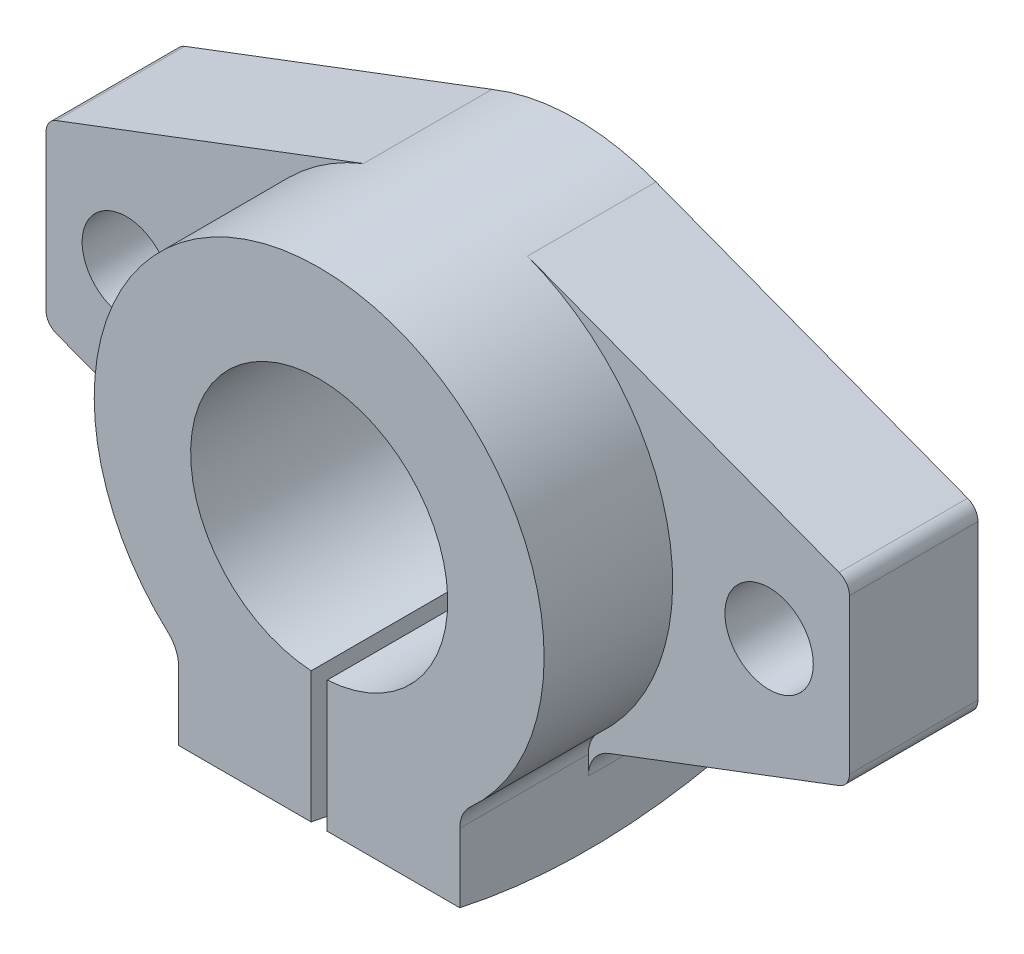
ISO-10303-21;
HEADER;
FILE_DESCRIPTION(('STEP AP214'),'2;1');
FILE_NAME('part.step','',(''),(''),'','','');
FILE_SCHEMA(('AUTOMOTIVE_DESIGN { 1 0 10303 214 1 1 1 1 }'));
ENDSEC;
DATA;
#1=APPLICATION_CONTEXT('core data for automotive mechanical design processes');
#2=APPLICATION_PROTOCOL_DEFINITION('international standard','automotive_design',2000,#1);
#3=PRODUCT_CONTEXT('',#1,'mechanical');
#4=PRODUCT('Part','Part','',(#3));
#5=PRODUCT_RELATED_PRODUCT_CATEGORY('part','',(#4));
#6=PRODUCT_DEFINITION_FORMATION('','',#4);
#7=PRODUCT_DEFINITION_CONTEXT('part definition',#1,'design');
#8=PRODUCT_DEFINITION('design','',#6,#7);
#9=PRODUCT_DEFINITION_SHAPE('','',#8);
#10=(LENGTH_UNIT() NAMED_UNIT(*) SI_UNIT(.MILLI.,.METRE.));
#11=(NAMED_UNIT(*) PLANE_ANGLE_UNIT() SI_UNIT($,.RADIAN.));
#12=(NAMED_UNIT(*) SI_UNIT($,.STERADIAN.) SOLID_ANGLE_UNIT());
#13=UNCERTAINTY_MEASURE_WITH_UNIT(LENGTH_MEASURE(1.E-05),#10,'distance_accuracy_value','');
#14=(GEOMETRIC_REPRESENTATION_CONTEXT(3) GLOBAL_UNCERTAINTY_ASSIGNED_CONTEXT((#13)) GLOBAL_UNIT_ASSIGNED_CONTEXT((#10,
#11,#12)) REPRESENTATION_CONTEXT('',''));
#15=CARTESIAN_POINT('',(0.,0.,0.));
#16=DIRECTION('',(0.,0.,1.));
#17=DIRECTION('',(1.,0.,0.));
#18=AXIS2_PLACEMENT_3D('',#15,#16,#17);
#19=CARTESIAN_POINT('',(-12.75,-10.85,0.));
#20=DIRECTION('',(-1.,0.,0.));
#21=DIRECTION('',(0.,0.,1.));
#22=AXIS2_PLACEMENT_3D('',#19,#20,#21);
#23=PLANE('',#22);
#24=CARTESIAN_POINT('',(-12.75,-12.5,0.));
#25=DIRECTION('',(1.,0.,0.));
#26=DIRECTION('',(0.,1.,0.));
#27=AXIS2_PLACEMENT_3D('',#24,#25,#26);
#28=CIRCLE('',#27,3.3);
#29=CARTESIAN_POINT('',(-12.75,-9.2,0.));
#30=VERTEX_POINT('',#29);
#31=EDGE_CURVE('E342',#30,#30,#28,.T.);
#32=ORIENTED_EDGE('',*,*,#31,.F.);
#33=EDGE_LOOP('',(#32));
#34=FACE_BOUND('',#33,.T.);
#35=ADVANCED_FACE('F16',(#34),#23,.T.);
#36=CARTESIAN_POINT('',(-24.,4.80936795279443,0.));
#37=DIRECTION('',(0.,0.,-1.));
#38=DIRECTION('',(-1.,0.,0.));
#39=AXIS2_PLACEMENT_3D('',#36,#37,#38);
#40=CYLINDRICAL_SURFACE('',#39,1.);
#41=CARTESIAN_POINT('',(-24.,4.80936795279443,0.));
#42=DIRECTION('',(0.,0.,-1.));
#43=DIRECTION('',(-1.,0.,0.));
#44=AXIS2_PLACEMENT_3D('',#41,#42,#43);
#45=CIRCLE('',#44,1.);
#46=CARTESIAN_POINT('',(-24.3541212387092,5.74456747604872,0.));
#47=VERTEX_POINT('',#46);
#48=CARTESIAN_POINT('',(-25.,4.80936795279443,0.));
#49=VERTEX_POINT('',#48);
#50=EDGE_CURVE('E327',#47,#49,#45,.F.);
#51=ORIENTED_EDGE('',*,*,#50,.F.);
#52=DIRECTION('',(0.,0.,1.));
#53=VECTOR('',#52,1.);
#54=CARTESIAN_POINT('',(-24.3541212387092,5.74456747604872,0.));
#55=LINE('',#54,#53);
#56=CARTESIAN_POINT('',(-24.3541212387092,5.74456747604872,-8.));
#57=VERTEX_POINT('',#56);
#58=EDGE_CURVE('E449',#57,#47,#55,.T.);
#59=ORIENTED_EDGE('',*,*,#58,.F.);
#60=CARTESIAN_POINT('',(-24.,4.80936795279443,-8.));
#61=DIRECTION('',(0.,0.,-1.));
#62=DIRECTION('',(-1.,0.,0.));
#63=AXIS2_PLACEMENT_3D('',#60,#61,#62);
#64=CIRCLE('',#63,1.);
#65=CARTESIAN_POINT('',(-25.,4.80936795279443,-8.));
#66=VERTEX_POINT('',#65);
#67=EDGE_CURVE('E19',#57,#66,#64,.F.);
#68=ORIENTED_EDGE('',*,*,#67,.T.);
#69=DIRECTION('',(0.,0.,1.));
#70=VECTOR('',#69,1.);
#71=CARTESIAN_POINT('',(-25.,4.80936795279443,0.));
#72=LINE('',#71,#70);
#73=EDGE_CURVE('E441',#49,#66,#72,.F.);
#74=ORIENTED_EDGE('',*,*,#73,.F.);
#75=EDGE_LOOP('',(#51,#59,#68,#74));
#76=FACE_BOUND('',#75,.T.);
#77=ADVANCED_FACE('F358',(#76),#40,.T.);
#78=CARTESIAN_POINT('',(-24.,-4.80948412841701,0.));
#79=DIRECTION('',(0.,0.,-1.));
#80=DIRECTION('',(-1.,0.,0.));
#81=AXIS2_PLACEMENT_3D('',#78,#79,#80);
#82=CYLINDRICAL_SURFACE('',#81,1.);
#83=CARTESIAN_POINT('',(-24.,-4.80948412841701,0.));
#84=DIRECTION('',(0.,0.,-1.));
#85=DIRECTION('',(-1.,0.,0.));
#86=AXIS2_PLACEMENT_3D('',#83,#84,#85);
#87=CIRCLE('',#86,1.);
#88=CARTESIAN_POINT('',(-25.,-4.80948412841701,0.));
#89=VERTEX_POINT('',#88);
#90=CARTESIAN_POINT('',(-24.3542683640526,-5.74462792817805,0.));
#91=VERTEX_POINT('',#90);
#92=EDGE_CURVE('E324',#89,#91,#87,.F.);
#93=ORIENTED_EDGE('',*,*,#92,.F.);
#94=DIRECTION('',(0.,0.,1.));
#95=VECTOR('',#94,1.);
#96=CARTESIAN_POINT('',(-25.,-4.80948412841701,0.));
#97=LINE('',#96,#95);
#98=CARTESIAN_POINT('',(-25.,-4.80948412841701,-8.));
#99=VERTEX_POINT('',#98);
#100=EDGE_CURVE('E444',#99,#89,#97,.T.);
#101=ORIENTED_EDGE('',*,*,#100,.F.);
#102=CARTESIAN_POINT('',(-24.,-4.80948412841701,-8.));
#103=DIRECTION('',(0.,0.,-1.));
#104=DIRECTION('',(-1.,0.,0.));
#105=AXIS2_PLACEMENT_3D('',#102,#103,#104);
#106=CIRCLE('',#105,1.);
#107=CARTESIAN_POINT('',(-24.3542683640526,-5.74462792817805,-8.));
#108=VERTEX_POINT('',#107);
#109=EDGE_CURVE('E350',#99,#108,#106,.F.);
#110=ORIENTED_EDGE('',*,*,#109,.T.);
#111=DIRECTION('',(0.,0.,1.));
#112=VECTOR('',#111,1.);
#113=CARTESIAN_POINT('',(-24.3542683640526,-5.74462792817805,0.));
#114=LINE('',#113,#112);
#115=EDGE_CURVE('E435',#91,#108,#114,.F.);
#116=ORIENTED_EDGE('',*,*,#115,.F.);
#117=EDGE_LOOP('',(#93,#101,#110,#116));
#118=FACE_BOUND('',#117,.T.);
#119=ADVANCED_FACE('F355',(#118),#82,.T.);
#120=CARTESIAN_POINT('',(-10.75,-11.8506328944913,0.));
#121=DIRECTION('',(0.,0.,-1.));
#122=DIRECTION('',(-1.,0.,0.));
#123=AXIS2_PLACEMENT_3D('',#120,#121,#122);
#124=CYLINDRICAL_SURFACE('',#123,2.);
#125=DIRECTION('',(0.,0.,1.));
#126=VECTOR('',#125,1.);
#127=CARTESIAN_POINT('',(-8.75,-11.8506328944913,0.));
#128=LINE('',#127,#126);
#129=CARTESIAN_POINT('',(-8.75,-11.8506328944913,8.));
#130=VERTEX_POINT('',#129);
#131=CARTESIAN_POINT('',(-8.75,-11.8506328944913,3.94693835298745));
#132=VERTEX_POINT('',#131);
#133=EDGE_CURVE('E276',#130,#132,#128,.F.);
#134=ORIENTED_EDGE('',*,*,#133,.F.);
#135=CARTESIAN_POINT('',(-10.75,-11.8506328944913,8.));
#136=DIRECTION('',(0.,0.,-1.));
#137=DIRECTION('',(-1.,0.,0.));
#138=AXIS2_PLACEMENT_3D('',#135,#136,#137);
#139=CIRCLE('',#138,2.);
#140=CARTESIAN_POINT('',(-9.40625,-10.3693037826799,8.));
#141=VERTEX_POINT('',#140);
#142=EDGE_CURVE('E338',#141,#130,#139,.T.);
#143=ORIENTED_EDGE('',*,*,#142,.F.);
#144=DIRECTION('',(0.,0.,1.));
#145=VECTOR('',#144,1.);
#146=CARTESIAN_POINT('',(-9.40625,-10.3693037826799,0.));
#147=LINE('',#146,#145);
#148=CARTESIAN_POINT('',(-9.40625,-10.3693037826799,3.38528191285421));
#149=VERTEX_POINT('',#148);
#150=EDGE_CURVE('E320',#149,#141,#147,.T.);
#151=ORIENTED_EDGE('',*,*,#150,.F.);
#152=CARTESIAN_POINT('',(-9.40625,-10.3693037826799,3.38528191285421));
#153=CARTESIAN_POINT('',(-9.36290375377059,-10.4086358011669,3.41004058560825));
#154=CARTESIAN_POINT('',(-9.32135149346892,-10.4497866027787,3.43498017581013));
#155=CARTESIAN_POINT('',(-9.24196716539282,-10.5356178659799,3.48477579679724));
#156=CARTESIAN_POINT('',(-9.20413672814161,-10.5802998592553,3.50963178639226));
#157=CARTESIAN_POINT('',(-9.09594866119553,-10.7201148222335,3.58373747090792));
#158=CARTESIAN_POINT('',(-9.03154264921437,-10.8204295224222,3.63214372105022));
#159=CARTESIAN_POINT('',(-8.92058739459877,-11.0335088216867,3.72328256857956));
#160=CARTESIAN_POINT('',(-8.87410282941123,-11.1463166575372,3.76599425862348));
#161=CARTESIAN_POINT('',(-8.82011882228535,-11.3221364602931,3.8231459164505));
#162=CARTESIAN_POINT('',(-8.80476341120851,-11.381715728302,3.84101426573029));
#163=CARTESIAN_POINT('',(-8.77952961599157,-11.5027031248496,3.87418608379235));
#164=CARTESIAN_POINT('',(-8.76964697302754,-11.5641097920088,3.88949154048895));
#165=CARTESIAN_POINT('',(-8.75845384797279,-11.663187216242,3.91167343384961));
#166=CARTESIAN_POINT('',(-8.75529396094485,-11.7004567088456,3.9194619556043));
#167=CARTESIAN_POINT('',(-8.75106626364265,-11.7753288215161,3.9339939876237));
#168=CARTESIAN_POINT('',(-8.74999912749323,-11.8129315450075,3.94073716051271));
#169=CARTESIAN_POINT('',(-8.74999999999998,-11.8506328944913,3.94693835298746));
#170=B_SPLINE_CURVE_WITH_KNOTS('',3,(#152,#153,#154,#155,#156,#157,#158,#159,#160,#161,#162,
#163,#164,#165,#166,#167,#168,#169),.UNSPECIFIED.,.F.,.F.,(4,2,2,2,2,2,2,2,4),(0.,
0.190550024260051,0.381183159798241,0.765278158826433,1.15074664026358,1.3426965868925,
1.53449695036704,1.64904765647814,1.76363525603966),.UNSPECIFIED.);
#171=EDGE_CURVE('E345',#149,#132,#170,.T.);
#172=ORIENTED_EDGE('',*,*,#171,.T.);
#173=EDGE_LOOP('',(#134,#143,#151,#172));
#174=FACE_BOUND('',#173,.T.);
#175=ADVANCED_FACE('F351',(#174),#124,.F.);
#176=CARTESIAN_POINT('',(-8.75,-12.5,0.));
#177=DIRECTION('',(-1.,0.,0.));
#178=DIRECTION('',(0.,-1.,0.));
#179=AXIS2_PLACEMENT_3D('',#176,#177,#178);
#180=CYLINDRICAL_SURFACE('',#179,4.);
#181=CARTESIAN_POINT('',(-8.75,-12.5,0.));
#182=DIRECTION('',(-1.,0.,0.));
#183=DIRECTION('',(0.,-1.,0.));
#184=AXIS2_PLACEMENT_3D('',#181,#182,#183);
#185=CIRCLE('',#184,4.);
#186=CARTESIAN_POINT('',(-8.75,-13.0371554509052,-3.96376891626679));
#187=VERTEX_POINT('',#186);
#188=EDGE_CURVE('E203',#132,#187,#185,.T.);
#189=ORIENTED_EDGE('',*,*,#188,.F.);
#190=ORIENTED_EDGE('',*,*,#171,.F.);
#191=CARTESIAN_POINT('',(-11.1242977306435,-8.5,0.));
#192=CARTESIAN_POINT('',(-11.124302606537,-8.49998103791648,0.0935589174680111));
#193=CARTESIAN_POINT('',(-11.121789952968,-8.50328167734567,0.187111973313613));
#194=CARTESIAN_POINT('',(-11.1117660898036,-8.51638299969971,0.373466439766758));
#195=CARTESIAN_POINT('',(-11.1042563051649,-8.52618182963078,0.466268057017254));
#196=CARTESIAN_POINT('',(-11.084311980008,-8.55209201700121,0.650089766350944));
#197=CARTESIAN_POINT('',(-11.0718959477411,-8.56817964824309,0.741115219907987));
#198=CARTESIAN_POINT('',(-11.0422085029878,-8.60640577183673,0.921078105889605));
#199=CARTESIAN_POINT('',(-11.0249369507948,-8.62854443829286,1.01001547815456));
#200=CARTESIAN_POINT('',(-10.9856468098831,-8.67851199888771,1.18511990489576));
#201=CARTESIAN_POINT('',(-10.9636321743549,-8.7063361533851,1.27128919815422));
#202=CARTESIAN_POINT('',(-10.9149722131074,-8.76726307684787,1.44040611370115));
#203=CARTESIAN_POINT('',(-10.8883251234464,-8.80036785616738,1.52335249399802));
#204=CARTESIAN_POINT('',(-10.8016563301982,-8.90688471235044,1.76656744364336));
#205=CARTESIAN_POINT('',(-10.7348717567217,-8.98754527375091,1.92136909533644));
#206=CARTESIAN_POINT('',(-10.581873309264,-9.16724463614666,2.21905960038411));
#207=CARTESIAN_POINT('',(-10.4949957296006,-9.26688390777267,2.36123560286901));
#208=CARTESIAN_POINT('',(-10.3052435441694,-9.47744979982444,2.62541049984556));
#209=CARTESIAN_POINT('',(-10.2023422992983,-9.58839510826189,2.74737508328354));
#210=CARTESIAN_POINT('',(-9.98898654420724,-9.81032448084697,2.96451935807605));
#211=CARTESIAN_POINT('',(-9.879294964554,-9.92094714500201,3.06082823313359));
#212=CARTESIAN_POINT('',(-9.70715069770885,-10.0884899467997,3.1921200574094));
#213=CARTESIAN_POINT('',(-9.64863546791339,-10.1444834958279,3.23361352630749));
#214=CARTESIAN_POINT('',(-9.52920498144106,-10.2567526356857,3.31248232464537));
#215=CARTESIAN_POINT('',(-9.46829073842246,-10.3130280988084,3.34985936858939));
#216=CARTESIAN_POINT('',(-9.40625,-10.3693037826799,3.38528191285421));
#217=B_SPLINE_CURVE_WITH_KNOTS('',3,(#191,#192,#193,#194,#195,#196,#197,#198,#199,#200,#201,
#202,#203,#204,#205,#206,#207,#208,#209,#210,#211,#212,#213,#214,#215,#216),.UNSPECIFIED.,.F.,
.F.,(4,2,2,2,2,2,2,2,2,2,2,2,4),(0.,0.280575719966824,0.56107146664932,0.840519025331161,
1.11997462530949,1.39919820389572,1.67852833879724,2.23669177820901,2.81692038106071,
3.39812411165703,3.94625748065688,4.21915240006884,4.49193322455444),.UNSPECIFIED.);
#218=CARTESIAN_POINT('',(-11.1242977306435,-8.5,0.));
#219=VERTEX_POINT('',#218);
#220=EDGE_CURVE('E313',#219,#149,#217,.T.);
#221=ORIENTED_EDGE('',*,*,#220,.F.);
#222=DIRECTION('',(1.,0.,0.));
#223=VECTOR('',#222,1.);
#224=CARTESIAN_POINT('',(-20.107411847981,-8.5,0.));
#225=LINE('',#224,#223);
#226=CARTESIAN_POINT('',(-17.0810558210984,-8.5,0.));
#227=VERTEX_POINT('',#226);
#228=EDGE_CURVE('E329',#227,#219,#225,.T.);
#229=ORIENTED_EDGE('',*,*,#228,.F.);
#230=CARTESIAN_POINT('',(-6.52246358256283,-12.5,0.));
#231=DIRECTION('',(-0.354268364052571,-0.935143799761039,0.));
#232=DIRECTION('',(-0.935143799761039,0.354268364052571,0.));
#233=AXIS2_PLACEMENT_3D('',#230,#231,#232);
#234=ELLIPSE('',#233,11.2908755222818,4.);
#235=CARTESIAN_POINT('',(-10.0414632718949,-11.1668678513831,-3.77130728982991));
#236=VERTEX_POINT('',#235);
#237=EDGE_CURVE('E283',#236,#227,#234,.F.);
#238=ORIENTED_EDGE('',*,*,#237,.F.);
#239=CARTESIAN_POINT('',(-10.0414632718949,-11.1668678513831,-3.77130728982991));
#240=CARTESIAN_POINT('',(-9.93512049002557,-11.2071077397204,-3.78549547611859));
#241=CARTESIAN_POINT('',(-9.83264431960935,-11.256339958876,-3.80221832793903));
#242=CARTESIAN_POINT('',(-9.63764184662692,-11.3711953934849,-3.83790023016697));
#243=CARTESIAN_POINT('',(-9.54512269229296,-11.4368302737308,-3.85686086689483));
#244=CARTESIAN_POINT('',(-9.37242611251462,-11.5828209386372,-3.89415317584599));
#245=CARTESIAN_POINT('',(-9.29224626091158,-11.6631738226154,-3.91248497116008));
#246=CARTESIAN_POINT('',(-9.14633952231219,-11.8366967493391,-3.94560714545216));
#247=CARTESIAN_POINT('',(-9.08060554384683,-11.9298604665748,-3.96039926237419));
#248=CARTESIAN_POINT('',(-8.96634740004916,-12.1254239641648,-3.98362453523745));
#249=CARTESIAN_POINT('',(-8.9176243132824,-12.2276981222889,-3.99213258677513));
#250=CARTESIAN_POINT('',(-8.83811569017473,-12.4393042942751,-4.00093395430842));
#251=CARTESIAN_POINT('',(-8.80730879344403,-12.5486277301645,-4.00123707227793));
#252=CARTESIAN_POINT('',(-8.77397074552113,-12.7219232915753,-3.99433107660609));
#253=CARTESIAN_POINT('',(-8.76496681968434,-12.7848572972454,-3.99034392424292));
#254=CARTESIAN_POINT('',(-8.75297954678965,-12.9109712972019,-3.97933753316006));
#255=CARTESIAN_POINT('',(-8.74999039612186,-12.9741509953729,-3.97232122519826));
#256=CARTESIAN_POINT('',(-8.75,-13.0371554509052,-3.96376891626679));
#257=B_SPLINE_CURVE_WITH_KNOTS('',3,(#239,#240,#241,#242,#243,#244,#245,#246,#247,#248,#249,
#250,#251,#252,#253,#254,#255,#256),.UNSPECIFIED.,.F.,.F.,(4,2,2,2,2,2,2,2,4),(0.,
0.343162421262567,0.686569581258249,1.02990913389552,1.37307976301679,1.71209128601672,
2.05069779306965,2.24147331645241,2.4320646735736),.UNSPECIFIED.);
#258=EDGE_CURVE('E208',#236,#187,#257,.T.);
#259=ORIENTED_EDGE('',*,*,#258,.T.);
#260=EDGE_LOOP('',(#189,#190,#221,#229,#238,#259));
#261=FACE_BOUND('',#260,.T.);
#262=ADVANCED_FACE('F285',(#261),#180,.F.);
#263=CARTESIAN_POINT('',(-10.75,-12.5,0.));
#264=DIRECTION('',(1.,0.,0.));
#265=DIRECTION('',(0.,1.,0.));
#266=AXIS2_PLACEMENT_3D('',#263,#264,#265);
#267=CYLINDRICAL_SURFACE('',#266,3.3);
#268=ORIENTED_EDGE('',*,*,#31,.T.);
#269=EDGE_LOOP('',(#268));
#270=FACE_BOUND('',#269,.T.);
#271=CARTESIAN_POINT('',(-8.75,-12.5,0.));
#272=DIRECTION('',(1.,0.,0.));
#273=DIRECTION('',(0.,1.,0.));
#274=AXIS2_PLACEMENT_3D('',#271,#272,#273);
#275=CIRCLE('',#274,3.3);
#276=CARTESIAN_POINT('',(-8.75,-9.2,0.));
#277=VERTEX_POINT('',#276);
#278=EDGE_CURVE('E272',#277,#277,#275,.T.);
#279=ORIENTED_EDGE('',*,*,#278,.F.);
#280=EDGE_LOOP('',(#279));
#281=FACE_BOUND('',#280,.T.);
#282=ADVANCED_FACE('F583',(#270,#281),#267,.T.);
#283=CARTESIAN_POINT('',(-0.749999999999997,-12.5,0.));
#284=DIRECTION('',(1.,0.,0.));
#285=DIRECTION('',(0.,1.,0.));
#286=AXIS2_PLACEMENT_3D('',#283,#284,#285);
#287=CYLINDRICAL_SURFACE('',#286,2.);
#288=CARTESIAN_POINT('',(-0.499999999999955,-12.5,0.));
#289=DIRECTION('',(1.,0.,0.));
#290=DIRECTION('',(0.,1.,0.));
#291=AXIS2_PLACEMENT_3D('',#288,#289,#290);
#292=CIRCLE('',#291,2.);
#293=CARTESIAN_POINT('',(-0.499999999999955,-10.5,0.));
#294=VERTEX_POINT('',#293);
#295=EDGE_CURVE('E262',#294,#294,#292,.T.);
#296=ORIENTED_EDGE('',*,*,#295,.T.);
#297=EDGE_LOOP('',(#296));
#298=FACE_BOUND('',#297,.T.);
#299=CARTESIAN_POINT('',(0.500000000000051,-12.5,0.));
#300=DIRECTION('',(1.,0.,0.));
#301=DIRECTION('',(0.,1.,0.));
#302=AXIS2_PLACEMENT_3D('',#299,#300,#301);
#303=CIRCLE('',#302,2.);
#304=CARTESIAN_POINT('',(0.500000000000051,-10.5,0.));
#305=VERTEX_POINT('',#304);
#306=EDGE_CURVE('E254',#305,#305,#303,.F.);
#307=ORIENTED_EDGE('',*,*,#306,.T.);
#308=EDGE_LOOP('',(#307));
#309=FACE_BOUND('',#308,.T.);
#310=ADVANCED_FACE('F581',(#298,#309),#287,.T.);
#311=CARTESIAN_POINT('',(10.75,-11.8506328944913,0.));
#312=DIRECTION('',(0.,0.,-1.));
#313=DIRECTION('',(-1.,0.,0.));
#314=AXIS2_PLACEMENT_3D('',#311,#312,#313);
#315=CYLINDRICAL_SURFACE('',#314,2.);
#316=DIRECTION('',(0.,0.,1.));
#317=VECTOR('',#316,1.);
#318=CARTESIAN_POINT('',(9.40625,-10.3693037826799,0.));
#319=LINE('',#318,#317);
#320=CARTESIAN_POINT('',(9.40625,-10.3693037826799,8.));
#321=VERTEX_POINT('',#320);
#322=CARTESIAN_POINT('',(9.40625,-10.3693037826799,0.));
#323=VERTEX_POINT('',#322);
#324=EDGE_CURVE('E476',#321,#323,#319,.F.);
#325=ORIENTED_EDGE('',*,*,#324,.F.);
#326=CARTESIAN_POINT('',(10.75,-11.8506328944913,8.));
#327=DIRECTION('',(0.,0.,-1.));
#328=DIRECTION('',(-1.,0.,0.));
#329=AXIS2_PLACEMENT_3D('',#326,#327,#328);
#330=CIRCLE('',#329,2.);
#331=CARTESIAN_POINT('',(8.75,-11.8506328944913,8.));
#332=VERTEX_POINT('',#331);
#333=EDGE_CURVE('E340',#332,#321,#330,.T.);
#334=ORIENTED_EDGE('',*,*,#333,.F.);
#335=DIRECTION('',(0.,0.,-1.));
#336=VECTOR('',#335,1.);
#337=CARTESIAN_POINT('',(8.75,-11.8506328944913,0.));
#338=LINE('',#337,#336);
#339=CARTESIAN_POINT('',(8.75,-11.8506328944913,0.));
#340=VERTEX_POINT('',#339);
#341=EDGE_CURVE('E252',#340,#332,#338,.F.);
#342=ORIENTED_EDGE('',*,*,#341,.F.);
#343=CARTESIAN_POINT('',(10.75,-11.8506328944913,0.));
#344=DIRECTION('',(0.,0.,-1.));
#345=DIRECTION('',(-1.,0.,0.));
#346=AXIS2_PLACEMENT_3D('',#343,#344,#345);
#347=CIRCLE('',#346,2.);
#348=EDGE_CURVE('E332',#323,#340,#347,.F.);
#349=ORIENTED_EDGE('',*,*,#348,.F.);
#350=EDGE_LOOP('',(#325,#334,#342,#349));
#351=FACE_BOUND('',#350,.T.);
#352=ADVANCED_FACE('F545',(#351),#315,.F.);
#353=CARTESIAN_POINT('',(0.00014287314499,-1.5380096072895,8.));
#354=DIRECTION('',(0.,0.,1.));
#355=DIRECTION('',(1.,0.,0.));
#356=AXIS2_PLACEMENT_3D('',#353,#354,#355);
#357=PLANE('',#356);
#358=ORIENTED_EDGE('',*,*,#142,.T.);
#359=DIRECTION('',(0.,1.,0.));
#360=VECTOR('',#359,1.);
#361=CARTESIAN_POINT('',(-8.75,-17.,8.));
#362=LINE('',#361,#360);
#363=CARTESIAN_POINT('',(-8.74999999999999,-16.1324115100822,8.));
#364=VERTEX_POINT('',#363);
#365=EDGE_CURVE('E207',#364,#130,#362,.T.);
#366=ORIENTED_EDGE('',*,*,#365,.F.);
#367=DIRECTION('',(1.,0.,0.));
#368=VECTOR('',#367,1.);
#369=CARTESIAN_POINT('',(-8.75,-16.1324115100822,8.00000000000001));
#370=LINE('',#369,#368);
#371=CARTESIAN_POINT('',(-0.49999999999999,-16.1324115100822,8.));
#372=VERTEX_POINT('',#371);
#373=EDGE_CURVE('E271',#372,#364,#370,.F.);
#374=ORIENTED_EDGE('',*,*,#373,.F.);
#375=DIRECTION('',(0.,1.,0.));
#376=VECTOR('',#375,1.);
#377=CARTESIAN_POINT('',(-0.499999999999999,-3.175,8.));
#378=LINE('',#377,#376);
#379=CARTESIAN_POINT('',(-0.499999999999999,-7.98435971133566,8.));
#380=VERTEX_POINT('',#379);
#381=EDGE_CURVE('E268',#372,#380,#378,.T.);
#382=ORIENTED_EDGE('',*,*,#381,.T.);
#383=CARTESIAN_POINT('',(0.,0.,8.));
#384=DIRECTION('',(0.,0.,1.));
#385=DIRECTION('',(1.,0.,0.));
#386=AXIS2_PLACEMENT_3D('',#383,#384,#385);
#387=CIRCLE('',#386,8.);
#388=CARTESIAN_POINT('',(0.500000000000004,-7.98435971133566,8.));
#389=VERTEX_POINT('',#388);
#390=EDGE_CURVE('E258',#380,#389,#387,.F.);
#391=ORIENTED_EDGE('',*,*,#390,.T.);
#392=DIRECTION('',(0.,1.,0.));
#393=VECTOR('',#392,1.);
#394=CARTESIAN_POINT('',(0.500000000000004,-17.,8.));
#395=LINE('',#394,#393);
#396=CARTESIAN_POINT('',(0.500000000000011,-16.1324115100822,8.));
#397=VERTEX_POINT('',#396);
#398=EDGE_CURVE('E257',#389,#397,#395,.F.);
#399=ORIENTED_EDGE('',*,*,#398,.T.);
#400=DIRECTION('',(1.,0.,0.));
#401=VECTOR('',#400,1.);
#402=CARTESIAN_POINT('',(-8.75,-16.1324115100822,8.00000000000001));
#403=LINE('',#402,#401);
#404=CARTESIAN_POINT('',(8.75000000000001,-16.1324115100822,8.));
#405=VERTEX_POINT('',#404);
#406=EDGE_CURVE('E253',#405,#397,#403,.F.);
#407=ORIENTED_EDGE('',*,*,#406,.F.);
#408=DIRECTION('',(0.,1.,0.));
#409=VECTOR('',#408,1.);
#410=CARTESIAN_POINT('',(8.75,-11.6561237077392,8.));
#411=LINE('',#410,#409);
#412=EDGE_CURVE('E249',#332,#405,#411,.F.);
#413=ORIENTED_EDGE('',*,*,#412,.F.);
#414=ORIENTED_EDGE('',*,*,#333,.T.);
#415=CARTESIAN_POINT('',(0.,0.,8.));
#416=DIRECTION('',(0.,0.,1.));
#417=DIRECTION('',(1.,0.,0.));
#418=AXIS2_PLACEMENT_3D('',#415,#416,#417);
#419=CIRCLE('',#418,14.);
#420=EDGE_CURVE('E322',#141,#321,#419,.F.);
#421=ORIENTED_EDGE('',*,*,#420,.F.);
#422=EDGE_LOOP('',(#358,#366,#374,#382,#391,#399,#407,#413,#414,#421));
#423=FACE_BOUND('',#422,.T.);
#424=ADVANCED_FACE('F519',(#423),#357,.T.);
#425=CARTESIAN_POINT('',(24.,4.80948412841701,0.));
#426=DIRECTION('',(0.,0.,1.));
#427=DIRECTION('',(1.,0.,0.));
#428=AXIS2_PLACEMENT_3D('',#425,#426,#427);
#429=CYLINDRICAL_SURFACE('',#428,1.);
#430=CARTESIAN_POINT('',(24.,4.80948412841701,-8.));
#431=DIRECTION('',(0.,0.,1.));
#432=DIRECTION('',(1.,0.,0.));
#433=AXIS2_PLACEMENT_3D('',#430,#431,#432);
#434=CIRCLE('',#433,1.);
#435=CARTESIAN_POINT('',(25.,4.80948412841701,-8.));
#436=VERTEX_POINT('',#435);
#437=CARTESIAN_POINT('',(24.3542683640526,5.74462792817805,-8.));
#438=VERTEX_POINT('',#437);
#439=EDGE_CURVE('E34',#436,#438,#434,.T.);
#440=ORIENTED_EDGE('',*,*,#439,.T.);
#441=DIRECTION('',(0.,0.,1.));
#442=VECTOR('',#441,1.);
#443=CARTESIAN_POINT('',(24.3542683640526,5.74462792817805,0.));
#444=LINE('',#443,#442);
#445=CARTESIAN_POINT('',(24.3542683640526,5.74462792817805,0.));
#446=VERTEX_POINT('',#445);
#447=EDGE_CURVE('E326',#446,#438,#444,.F.);
#448=ORIENTED_EDGE('',*,*,#447,.F.);
#449=CARTESIAN_POINT('',(24.,4.80948412841701,0.));
#450=DIRECTION('',(0.,0.,1.));
#451=DIRECTION('',(1.,0.,0.));
#452=AXIS2_PLACEMENT_3D('',#449,#450,#451);
#453=CIRCLE('',#452,1.);
#454=CARTESIAN_POINT('',(25.,4.80948412841701,0.));
#455=VERTEX_POINT('',#454);
#456=EDGE_CURVE('E334',#455,#446,#453,.T.);
#457=ORIENTED_EDGE('',*,*,#456,.F.);
#458=DIRECTION('',(0.,0.,-1.));
#459=VECTOR('',#458,1.);
#460=CARTESIAN_POINT('',(25.,4.80948412841701,0.));
#461=LINE('',#460,#459);
#462=EDGE_CURVE('E462',#436,#455,#461,.F.);
#463=ORIENTED_EDGE('',*,*,#462,.F.);
#464=EDGE_LOOP('',(#440,#448,#457,#463));
#465=FACE_BOUND('',#464,.T.);
#466=ADVANCED_FACE('F567',(#465),#429,.T.);
#467=CARTESIAN_POINT('',(24.,-4.809484128417,0.));
#468=DIRECTION('',(0.,0.,-1.));
#469=DIRECTION('',(-1.,0.,0.));
#470=AXIS2_PLACEMENT_3D('',#467,#468,#469);
#471=CYLINDRICAL_SURFACE('',#470,1.);
#472=CARTESIAN_POINT('',(24.,-4.809484128417,0.));
#473=DIRECTION('',(0.,0.,-1.));
#474=DIRECTION('',(-1.,0.,0.));
#475=AXIS2_PLACEMENT_3D('',#472,#473,#474);
#476=CIRCLE('',#475,1.);
#477=CARTESIAN_POINT('',(24.3542683640526,-5.74462792817804,0.));
#478=VERTEX_POINT('',#477);
#479=CARTESIAN_POINT('',(25.,-4.809484128417,0.));
#480=VERTEX_POINT('',#479);
#481=EDGE_CURVE('E330',#478,#480,#476,.F.);
#482=ORIENTED_EDGE('',*,*,#481,.F.);
#483=DIRECTION('',(0.,0.,1.));
#484=VECTOR('',#483,1.);
#485=CARTESIAN_POINT('',(24.3542683640526,-5.74462792817804,0.));
#486=LINE('',#485,#484);
#487=CARTESIAN_POINT('',(24.3542683640526,-5.74462792817804,-8.));
#488=VERTEX_POINT('',#487);
#489=EDGE_CURVE('E465',#488,#478,#486,.T.);
#490=ORIENTED_EDGE('',*,*,#489,.F.);
#491=CARTESIAN_POINT('',(24.,-4.809484128417,-8.));
#492=DIRECTION('',(0.,0.,-1.));
#493=DIRECTION('',(-1.,0.,0.));
#494=AXIS2_PLACEMENT_3D('',#491,#492,#493);
#495=CIRCLE('',#494,1.);
#496=CARTESIAN_POINT('',(25.,-4.809484128417,-8.));
#497=VERTEX_POINT('',#496);
#498=EDGE_CURVE('E175',#488,#497,#495,.F.);
#499=ORIENTED_EDGE('',*,*,#498,.T.);
#500=DIRECTION('',(0.,0.,-1.));
#501=VECTOR('',#500,1.);
#502=CARTESIAN_POINT('',(25.,-4.809484128417,0.));
#503=LINE('',#502,#501);
#504=EDGE_CURVE('E242',#480,#497,#503,.T.);
#505=ORIENTED_EDGE('',*,*,#504,.F.);
#506=EDGE_LOOP('',(#482,#490,#499,#505));
#507=FACE_BOUND('',#506,.T.);
#508=ADVANCED_FACE('F535',(#507),#471,.T.);
#509=CARTESIAN_POINT('',(20.107411847981,1.69496129292404,0.));
#510=DIRECTION('',(0.,0.,1.));
#511=DIRECTION('',(1.,0.,0.));
#512=AXIS2_PLACEMENT_3D('',#509,#510,#511);
#513=PLANE('',#512);
#514=CARTESIAN_POINT('',(20.,0.,0.));
#515=DIRECTION('',(0.,0.,1.));
#516=DIRECTION('',(1.,0.,0.));
#517=AXIS2_PLACEMENT_3D('',#514,#515,#516);
#518=CIRCLE('',#517,2.75);
#519=CARTESIAN_POINT('',(22.75,0.,0.));
#520=VERTEX_POINT('',#519);
#521=EDGE_CURVE('E239',#520,#520,#518,.F.);
#522=ORIENTED_EDGE('',*,*,#521,.T.);
#523=EDGE_LOOP('',(#522));
#524=FACE_BOUND('',#523,.T.);
#525=ORIENTED_EDGE('',*,*,#481,.T.);
#526=DIRECTION('',(0.,1.,0.));
#527=VECTOR('',#526,1.);
#528=CARTESIAN_POINT('',(25.,5.5,0.));
#529=LINE('',#528,#527);
#530=EDGE_CURVE('E459',#455,#480,#529,.F.);
#531=ORIENTED_EDGE('',*,*,#530,.F.);
#532=ORIENTED_EDGE('',*,*,#456,.T.);
#533=DIRECTION('',(-0.935143799761039,0.354268364052571,0.));
#534=VECTOR('',#533,1.);
#535=CARTESIAN_POINT('',(4.959757096736,13.0920131966546,0.));
#536=LINE('',#535,#534);
#537=CARTESIAN_POINT('',(4.959757096736,13.0920131966546,0.));
#538=VERTEX_POINT('',#537);
#539=EDGE_CURVE('E321',#538,#446,#536,.F.);
#540=ORIENTED_EDGE('',*,*,#539,.F.);
#541=CARTESIAN_POINT('',(0.,0.,0.));
#542=DIRECTION('',(0.,0.,1.));
#543=DIRECTION('',(1.,0.,0.));
#544=AXIS2_PLACEMENT_3D('',#541,#542,#543);
#545=CIRCLE('',#544,14.);
#546=EDGE_CURVE('E455',#323,#538,#545,.T.);
#547=ORIENTED_EDGE('',*,*,#546,.F.);
#548=ORIENTED_EDGE('',*,*,#348,.T.);
#549=DIRECTION('',(0.,1.,0.));
#550=VECTOR('',#549,1.);
#551=CARTESIAN_POINT('',(8.75,-11.6561237077392,0.));
#552=LINE('',#551,#550);
#553=CARTESIAN_POINT('',(8.75,-13.0371554509052,0.));
#554=VERTEX_POINT('',#553);
#555=EDGE_CURVE('E248',#554,#340,#552,.T.);
#556=ORIENTED_EDGE('',*,*,#555,.F.);
#557=CARTESIAN_POINT('',(10.75,-13.0371554509052,0.));
#558=DIRECTION('',(0.,0.,-1.));
#559=DIRECTION('',(-1.,0.,0.));
#560=AXIS2_PLACEMENT_3D('',#557,#558,#559);
#561=CIRCLE('',#560,2.);
#562=CARTESIAN_POINT('',(10.0414632718949,-11.1668678513832,0.));
#563=VERTEX_POINT('',#562);
#564=EDGE_CURVE('E243',#554,#563,#561,.T.);
#565=ORIENTED_EDGE('',*,*,#564,.T.);
#566=DIRECTION('',(0.935143799761039,0.354268364052572,0.));
#567=VECTOR('',#566,1.);
#568=CARTESIAN_POINT('',(25.,-5.5,0.));
#569=LINE('',#568,#567);
#570=EDGE_CURVE('E463',#478,#563,#569,.F.);
#571=ORIENTED_EDGE('',*,*,#570,.F.);
#572=EDGE_LOOP('',(#525,#531,#532,#540,#547,#548,#556,#565,#571));
#573=FACE_BOUND('',#572,.T.);
#574=ADVANCED_FACE('F538',(#524,#573),#513,.T.);
#575=CARTESIAN_POINT('',(-20.107411847981,1.69496129292404,0.));
#576=DIRECTION('',(0.,0.,1.));
#577=DIRECTION('',(1.,0.,0.));
#578=AXIS2_PLACEMENT_3D('',#575,#576,#577);
#579=PLANE('',#578);
#580=CARTESIAN_POINT('',(-20.,0.,0.));
#581=DIRECTION('',(0.,0.,1.));
#582=DIRECTION('',(1.,0.,0.));
#583=AXIS2_PLACEMENT_3D('',#580,#581,#582);
#584=CIRCLE('',#583,2.75);
#585=CARTESIAN_POINT('',(-17.25,0.,0.));
#586=VERTEX_POINT('',#585);
#587=EDGE_CURVE('E236',#586,#586,#584,.F.);
#588=ORIENTED_EDGE('',*,*,#587,.T.);
#589=EDGE_LOOP('',(#588));
#590=FACE_BOUND('',#589,.T.);
#591=ORIENTED_EDGE('',*,*,#92,.T.);
#592=DIRECTION('',(0.935143799761039,-0.354268364052571,0.));
#593=VECTOR('',#592,1.);
#594=CARTESIAN_POINT('',(-8.75,-11.6561237077392,0.));
#595=LINE('',#594,#593);
#596=EDGE_CURVE('E436',#227,#91,#595,.F.);
#597=ORIENTED_EDGE('',*,*,#596,.F.);
#598=ORIENTED_EDGE('',*,*,#228,.T.);
#599=CARTESIAN_POINT('',(0.,0.,0.));
#600=DIRECTION('',(0.,0.,1.));
#601=DIRECTION('',(1.,0.,0.));
#602=AXIS2_PLACEMENT_3D('',#599,#600,#601);
#603=CIRCLE('',#602,14.);
#604=CARTESIAN_POINT('',(-5.2438318420207,12.9808407898953,0.));
#605=VERTEX_POINT('',#604);
#606=EDGE_CURVE('E451',#605,#219,#603,.T.);
#607=ORIENTED_EDGE('',*,*,#606,.F.);
#608=DIRECTION('',(-0.935199523254287,-0.354121238709222,0.));
#609=VECTOR('',#608,1.);
#610=CARTESIAN_POINT('',(-25.,5.5,0.));
#611=LINE('',#610,#609);
#612=EDGE_CURVE('E448',#47,#605,#611,.F.);
#613=ORIENTED_EDGE('',*,*,#612,.F.);
#614=ORIENTED_EDGE('',*,*,#50,.T.);
#615=DIRECTION('',(0.,1.,0.));
#616=VECTOR('',#615,1.);
#617=CARTESIAN_POINT('',(-25.,-5.5,0.));
#618=LINE('',#617,#616);
#619=EDGE_CURVE('E446',#89,#49,#618,.T.);
#620=ORIENTED_EDGE('',*,*,#619,.F.);
#621=EDGE_LOOP('',(#591,#597,#598,#607,#613,#614,#620));
#622=FACE_BOUND('',#621,.T.);
#623=ADVANCED_FACE('F662',(#590,#622),#579,.T.);
#624=CARTESIAN_POINT('',(4.959757096736,13.0920131966546,0.));
#625=DIRECTION('',(0.354268364052571,0.935143799761039,0.));
#626=DIRECTION('',(-0.935143799761039,0.354268364052571,0.));
#627=AXIS2_PLACEMENT_3D('',#624,#625,#626);
#628=PLANE('',#627);
#629=DIRECTION('',(0.,0.,1.));
#630=VECTOR('',#629,1.);
#631=CARTESIAN_POINT('',(4.959757096736,13.0920131966546,0.));
#632=LINE('',#631,#630);
#633=CARTESIAN_POINT('',(4.959757096736,13.0920131966546,-8.));
#634=VERTEX_POINT('',#633);
#635=EDGE_CURVE('E453',#538,#634,#632,.F.);
#636=ORIENTED_EDGE('',*,*,#635,.F.);
#637=ORIENTED_EDGE('',*,*,#539,.T.);
#638=ORIENTED_EDGE('',*,*,#447,.T.);
#639=DIRECTION('',(-0.935143799761039,0.354268364052571,0.));
#640=VECTOR('',#639,1.);
#641=CARTESIAN_POINT('',(24.3542683640526,5.74462792817805,-8.));
#642=LINE('',#641,#640);
#643=EDGE_CURVE('E235',#438,#634,#642,.T.);
#644=ORIENTED_EDGE('',*,*,#643,.T.);
#645=EDGE_LOOP('',(#636,#637,#638,#644));
#646=FACE_BOUND('',#645,.T.);
#647=ADVANCED_FACE('F309',(#646),#628,.T.);
#648=CARTESIAN_POINT('',(0.,0.,0.));
#649=DIRECTION('',(0.,0.,1.));
#650=DIRECTION('',(1.,0.,0.));
#651=AXIS2_PLACEMENT_3D('',#648,#649,#650);
#652=CYLINDRICAL_SURFACE('',#651,14.);
#653=DIRECTION('',(0.,0.,1.));
#654=VECTOR('',#653,1.);
#655=CARTESIAN_POINT('',(-5.24383184202087,12.9808407898952,0.));
#656=LINE('',#655,#654);
#657=CARTESIAN_POINT('',(-5.24383184202098,12.9808407898952,-8.));
#658=VERTEX_POINT('',#657);
#659=EDGE_CURVE('E88',#605,#658,#656,.F.);
#660=ORIENTED_EDGE('',*,*,#659,.F.);
#661=ORIENTED_EDGE('',*,*,#606,.T.);
#662=ORIENTED_EDGE('',*,*,#220,.T.);
#663=ORIENTED_EDGE('',*,*,#150,.T.);
#664=ORIENTED_EDGE('',*,*,#420,.T.);
#665=ORIENTED_EDGE('',*,*,#324,.T.);
#666=ORIENTED_EDGE('',*,*,#546,.T.);
#667=ORIENTED_EDGE('',*,*,#635,.T.);
#668=CARTESIAN_POINT('',(0.,0.,-8.));
#669=DIRECTION('',(0.,0.,1.));
#670=DIRECTION('',(1.,0.,0.));
#671=AXIS2_PLACEMENT_3D('',#668,#669,#670);
#672=CIRCLE('',#671,14.);
#673=EDGE_CURVE('E231',#634,#658,#672,.T.);
#674=ORIENTED_EDGE('',*,*,#673,.T.);
#675=EDGE_LOOP('',(#660,#661,#662,#663,#664,#665,#666,#667,#674));
#676=FACE_BOUND('',#675,.T.);
#677=ADVANCED_FACE('F305',(#676),#652,.T.);
#678=CARTESIAN_POINT('',(-25.,5.5,0.));
#679=DIRECTION('',(-0.354121238709222,0.935199523254287,0.));
#680=DIRECTION('',(-0.935199523254287,-0.354121238709222,0.));
#681=AXIS2_PLACEMENT_3D('',#678,#679,#680);
#682=PLANE('',#681);
#683=ORIENTED_EDGE('',*,*,#659,.T.);
#684=DIRECTION('',(-0.935199523254287,-0.354121238709222,0.));
#685=VECTOR('',#684,1.);
#686=CARTESIAN_POINT('',(-5.24383184202104,12.9808407898952,-8.));
#687=LINE('',#686,#685);
#688=EDGE_CURVE('E234',#658,#57,#687,.T.);
#689=ORIENTED_EDGE('',*,*,#688,.T.);
#690=ORIENTED_EDGE('',*,*,#58,.T.);
#691=ORIENTED_EDGE('',*,*,#612,.T.);
#692=EDGE_LOOP('',(#683,#689,#690,#691));
#693=FACE_BOUND('',#692,.T.);
#694=ADVANCED_FACE('F301',(#693),#682,.T.);
#695=CARTESIAN_POINT('',(-25.,-5.5,0.));
#696=DIRECTION('',(-1.,0.,0.));
#697=DIRECTION('',(0.,0.,1.));
#698=AXIS2_PLACEMENT_3D('',#695,#696,#697);
#699=PLANE('',#698);
#700=ORIENTED_EDGE('',*,*,#100,.T.);
#701=ORIENTED_EDGE('',*,*,#619,.T.);
#702=ORIENTED_EDGE('',*,*,#73,.T.);
#703=DIRECTION('',(0.,1.,0.));
#704=VECTOR('',#703,1.);
#705=CARTESIAN_POINT('',(-25.,-1.5380096072895,-8.));
#706=LINE('',#705,#704);
#707=EDGE_CURVE('E225',#66,#99,#706,.F.);
#708=ORIENTED_EDGE('',*,*,#707,.T.);
#709=EDGE_LOOP('',(#700,#701,#702,#708));
#710=FACE_BOUND('',#709,.T.);
#711=ADVANCED_FACE('F297',(#710),#699,.T.);
#712=CARTESIAN_POINT('',(-8.75,-11.6561237077392,0.));
#713=DIRECTION('',(-0.354268364052571,-0.935143799761039,0.));
#714=DIRECTION('',(0.935143799761039,-0.354268364052571,0.));
#715=AXIS2_PLACEMENT_3D('',#712,#713,#714);
#716=PLANE('',#715);
#717=DIRECTION('',(0.935143799761039,-0.354268364052572,0.));
#718=VECTOR('',#717,1.);
#719=CARTESIAN_POINT('',(-24.3542683640526,-5.74462792817804,-8.));
#720=LINE('',#719,#718);
#721=CARTESIAN_POINT('',(-10.0414632718949,-11.1668678513831,-8.));
#722=VERTEX_POINT('',#721);
#723=EDGE_CURVE('E223',#108,#722,#720,.T.);
#724=ORIENTED_EDGE('',*,*,#723,.T.);
#725=DIRECTION('',(0.,0.,-1.));
#726=VECTOR('',#725,1.);
#727=CARTESIAN_POINT('',(-10.0414632718949,-11.1668678513831,0.));
#728=LINE('',#727,#726);
#729=EDGE_CURVE('E222',#722,#236,#728,.F.);
#730=ORIENTED_EDGE('',*,*,#729,.T.);
#731=ORIENTED_EDGE('',*,*,#237,.T.);
#732=ORIENTED_EDGE('',*,*,#596,.T.);
#733=ORIENTED_EDGE('',*,*,#115,.T.);
#734=EDGE_LOOP('',(#724,#730,#731,#732,#733));
#735=FACE_BOUND('',#734,.T.);
#736=ADVANCED_FACE('F293',(#735),#716,.T.);
#737=CARTESIAN_POINT('',(-10.75,-13.0371554509052,0.));
#738=DIRECTION('',(0.,0.,-1.));
#739=DIRECTION('',(-1.,0.,0.));
#740=AXIS2_PLACEMENT_3D('',#737,#738,#739);
#741=CYLINDRICAL_SURFACE('',#740,2.);
#742=ORIENTED_EDGE('',*,*,#729,.F.);
#743=CARTESIAN_POINT('',(-10.75,-13.0371554509052,-8.));
#744=DIRECTION('',(0.,0.,-1.));
#745=DIRECTION('',(-1.,0.,0.));
#746=AXIS2_PLACEMENT_3D('',#743,#744,#745);
#747=CIRCLE('',#746,2.);
#748=CARTESIAN_POINT('',(-8.75,-13.0371554509052,-8.));
#749=VERTEX_POINT('',#748);
#750=EDGE_CURVE('E214',#722,#749,#747,.T.);
#751=ORIENTED_EDGE('',*,*,#750,.T.);
#752=DIRECTION('',(0.,0.,1.));
#753=VECTOR('',#752,1.);
#754=CARTESIAN_POINT('',(-8.75,-13.0371554509052,0.));
#755=LINE('',#754,#753);
#756=EDGE_CURVE('E197',#187,#749,#755,.F.);
#757=ORIENTED_EDGE('',*,*,#756,.F.);
#758=ORIENTED_EDGE('',*,*,#258,.F.);
#759=EDGE_LOOP('',(#742,#751,#757,#758));
#760=FACE_BOUND('',#759,.T.);
#761=ADVANCED_FACE('F220',(#760),#741,.F.);
#762=CARTESIAN_POINT('',(-8.75,-17.,0.));
#763=DIRECTION('',(-1.,0.,0.));
#764=DIRECTION('',(0.,0.,1.));
#765=AXIS2_PLACEMENT_3D('',#762,#763,#764);
#766=PLANE('',#765);
#767=ORIENTED_EDGE('',*,*,#278,.T.);
#768=EDGE_LOOP('',(#767));
#769=FACE_BOUND('',#768,.T.);
#770=ORIENTED_EDGE('',*,*,#133,.T.);
#771=ORIENTED_EDGE('',*,*,#188,.T.);
#772=ORIENTED_EDGE('',*,*,#756,.T.);
#773=DIRECTION('',(0.,1.,0.));
#774=VECTOR('',#773,1.);
#775=CARTESIAN_POINT('',(-8.75,-1.5380096072895,-8.));
#776=LINE('',#775,#774);
#777=CARTESIAN_POINT('',(-8.74999999999999,-16.1324115100822,-8.));
#778=VERTEX_POINT('',#777);
#779=EDGE_CURVE('E201',#749,#778,#776,.F.);
#780=ORIENTED_EDGE('',*,*,#779,.T.);
#781=CARTESIAN_POINT('',(-8.74999999999999,20.317639952768,0.));
#782=DIRECTION('',(1.,0.,0.));
#783=DIRECTION('',(0.,1.,0.));
#784=AXIS2_PLACEMENT_3D('',#781,#782,#783);
#785=CIRCLE('',#784,37.3176399527679);
#786=EDGE_CURVE('E269',#364,#778,#785,.T.);
#787=ORIENTED_EDGE('',*,*,#786,.F.);
#788=ORIENTED_EDGE('',*,*,#365,.T.);
#789=EDGE_LOOP('',(#770,#771,#772,#780,#787,#788));
#790=FACE_BOUND('',#789,.T.);
#791=ADVANCED_FACE('F199',(#769,#790),#766,.T.);
#792=CARTESIAN_POINT('',(-8.74999999999998,20.317639952768,0.));
#793=DIRECTION('',(1.,0.,0.));
#794=DIRECTION('',(0.,1.,0.));
#795=AXIS2_PLACEMENT_3D('',#792,#793,#794);
#796=CYLINDRICAL_SURFACE('',#795,37.3176399527679);
#797=ORIENTED_EDGE('',*,*,#786,.T.);
#798=DIRECTION('',(1.,0.,0.));
#799=VECTOR('',#798,1.);
#800=CARTESIAN_POINT('',(0.000142873144991,-16.1324115100822,-8.));
#801=LINE('',#800,#799);
#802=CARTESIAN_POINT('',(-0.499999999999989,-16.1324115100822,-8.));
#803=VERTEX_POINT('',#802);
#804=EDGE_CURVE('E218',#778,#803,#801,.T.);
#805=ORIENTED_EDGE('',*,*,#804,.T.);
#806=CARTESIAN_POINT('',(-0.499999999999981,20.3176399527679,0.));
#807=DIRECTION('',(1.,0.,0.));
#808=DIRECTION('',(0.,1.,0.));
#809=AXIS2_PLACEMENT_3D('',#806,#807,#808);
#810=CIRCLE('',#809,37.3176399527679);
#811=EDGE_CURVE('E265',#803,#372,#810,.F.);
#812=ORIENTED_EDGE('',*,*,#811,.T.);
#813=ORIENTED_EDGE('',*,*,#373,.T.);
#814=EDGE_LOOP('',(#797,#805,#812,#813));
#815=FACE_BOUND('',#814,.T.);
#816=ADVANCED_FACE('F413',(#815),#796,.T.);
#817=CARTESIAN_POINT('',(-0.499999999999999,-3.175,8.));
#818=DIRECTION('',(-1.,0.,0.));
#819=DIRECTION('',(0.,0.,1.));
#820=AXIS2_PLACEMENT_3D('',#817,#818,#819);
#821=PLANE('',#820);
#822=ORIENTED_EDGE('',*,*,#295,.F.);
#823=EDGE_LOOP('',(#822));
#824=FACE_BOUND('',#823,.T.);
#825=DIRECTION('',(0.,1.,0.));
#826=VECTOR('',#825,1.);
#827=CARTESIAN_POINT('',(-0.499999999999995,-1.5380096072895,-8.));
#828=LINE('',#827,#826);
#829=CARTESIAN_POINT('',(-0.499999999999997,-7.98435971133566,-8.));
#830=VERTEX_POINT('',#829);
#831=EDGE_CURVE('E498',#803,#830,#828,.T.);
#832=ORIENTED_EDGE('',*,*,#831,.T.);
#833=DIRECTION('',(0.,0.,1.));
#834=VECTOR('',#833,1.);
#835=CARTESIAN_POINT('',(-0.499999999999999,-7.98435971133565,0.));
#836=LINE('',#835,#834);
#837=EDGE_CURVE('E261',#830,#380,#836,.T.);
#838=ORIENTED_EDGE('',*,*,#837,.T.);
#839=ORIENTED_EDGE('',*,*,#381,.F.);
#840=ORIENTED_EDGE('',*,*,#811,.F.);
#841=EDGE_LOOP('',(#832,#838,#839,#840));
#842=FACE_BOUND('',#841,.T.);
#843=ADVANCED_FACE('F410',(#824,#842),#821,.F.);
#844=CARTESIAN_POINT('',(0.,0.,0.));
#845=DIRECTION('',(0.,0.,1.));
#846=DIRECTION('',(1.,0.,0.));
#847=AXIS2_PLACEMENT_3D('',#844,#845,#846);
#848=CYLINDRICAL_SURFACE('',#847,8.);
#849=ORIENTED_EDGE('',*,*,#390,.F.);
#850=ORIENTED_EDGE('',*,*,#837,.F.);
#851=CARTESIAN_POINT('',(0.,0.,-8.));
#852=DIRECTION('',(0.,0.,1.));
#853=DIRECTION('',(1.,0.,0.));
#854=AXIS2_PLACEMENT_3D('',#851,#852,#853);
#855=CIRCLE('',#854,8.);
#856=CARTESIAN_POINT('',(0.500000000000003,-7.98435971133566,-8.));
#857=VERTEX_POINT('',#856);
#858=EDGE_CURVE('E229',#830,#857,#855,.F.);
#859=ORIENTED_EDGE('',*,*,#858,.T.);
#860=DIRECTION('',(0.,0.,-1.));
#861=VECTOR('',#860,1.);
#862=CARTESIAN_POINT('',(0.500000000000004,-7.98435971133566,8.));
#863=LINE('',#862,#861);
#864=EDGE_CURVE('E260',#857,#389,#863,.F.);
#865=ORIENTED_EDGE('',*,*,#864,.T.);
#866=EDGE_LOOP('',(#849,#850,#859,#865));
#867=FACE_BOUND('',#866,.T.);
#868=ADVANCED_FACE('F406',(#867),#848,.F.);
#869=CARTESIAN_POINT('',(0.500000000000004,-17.,8.));
#870=DIRECTION('',(1.,0.,0.));
#871=DIRECTION('',(0.,0.,-1.));
#872=AXIS2_PLACEMENT_3D('',#869,#870,#871);
#873=PLANE('',#872);
#874=ORIENTED_EDGE('',*,*,#306,.F.);
#875=EDGE_LOOP('',(#874));
#876=FACE_BOUND('',#875,.T.);
#877=ORIENTED_EDGE('',*,*,#398,.F.);
#878=ORIENTED_EDGE('',*,*,#864,.F.);
#879=DIRECTION('',(0.,1.,0.));
#880=VECTOR('',#879,1.);
#881=CARTESIAN_POINT('',(0.500000000000002,-1.5380096072895,-8.));
#882=LINE('',#881,#880);
#883=CARTESIAN_POINT('',(0.50000000000001,-16.1324115100822,-8.));
#884=VERTEX_POINT('',#883);
#885=EDGE_CURVE('E492',#857,#884,#882,.F.);
#886=ORIENTED_EDGE('',*,*,#885,.T.);
#887=CARTESIAN_POINT('',(0.500000000000018,20.3176399527679,0.));
#888=DIRECTION('',(1.,0.,0.));
#889=DIRECTION('',(0.,1.,0.));
#890=AXIS2_PLACEMENT_3D('',#887,#888,#889);
#891=CIRCLE('',#890,37.3176399527679);
#892=EDGE_CURVE('E250',#397,#884,#891,.T.);
#893=ORIENTED_EDGE('',*,*,#892,.F.);
#894=EDGE_LOOP('',(#877,#878,#886,#893));
#895=FACE_BOUND('',#894,.T.);
#896=ADVANCED_FACE('F402',(#876,#895),#873,.F.);
#897=CARTESIAN_POINT('',(-8.74999999999998,20.317639952768,0.));
#898=DIRECTION('',(1.,0.,0.));
#899=DIRECTION('',(0.,1.,0.));
#900=AXIS2_PLACEMENT_3D('',#897,#898,#899);
#901=CYLINDRICAL_SURFACE('',#900,37.3176399527679);
#902=ORIENTED_EDGE('',*,*,#892,.T.);
#903=DIRECTION('',(1.,0.,0.));
#904=VECTOR('',#903,1.);
#905=CARTESIAN_POINT('',(0.000142873144991,-16.1324115100822,-8.));
#906=LINE('',#905,#904);
#907=CARTESIAN_POINT('',(8.75000000000001,-16.1324115100822,-8.));
#908=VERTEX_POINT('',#907);
#909=EDGE_CURVE('E487',#884,#908,#906,.T.);
#910=ORIENTED_EDGE('',*,*,#909,.T.);
#911=CARTESIAN_POINT('',(8.75000000000002,20.3176399527679,0.));
#912=DIRECTION('',(1.,0.,0.));
#913=DIRECTION('',(0.,1.,0.));
#914=AXIS2_PLACEMENT_3D('',#911,#912,#913);
#915=CIRCLE('',#914,37.3176399527679);
#916=EDGE_CURVE('E246',#405,#908,#915,.T.);
#917=ORIENTED_EDGE('',*,*,#916,.F.);
#918=ORIENTED_EDGE('',*,*,#406,.T.);
#919=EDGE_LOOP('',(#902,#910,#917,#918));
#920=FACE_BOUND('',#919,.T.);
#921=ADVANCED_FACE('F398',(#920),#901,.T.);
#922=CARTESIAN_POINT('',(8.75,-11.6561237077392,0.));
#923=DIRECTION('',(1.,0.,0.));
#924=DIRECTION('',(0.,0.,-1.));
#925=AXIS2_PLACEMENT_3D('',#922,#923,#924);
#926=PLANE('',#925);
#927=DIRECTION('',(0.,0.,-1.));
#928=VECTOR('',#927,1.);
#929=CARTESIAN_POINT('',(8.75,-13.0371554509052,0.));
#930=LINE('',#929,#928);
#931=CARTESIAN_POINT('',(8.75,-13.0371554509052,-8.));
#932=VERTEX_POINT('',#931);
#933=EDGE_CURVE('E245',#932,#554,#930,.F.);
#934=ORIENTED_EDGE('',*,*,#933,.T.);
#935=ORIENTED_EDGE('',*,*,#555,.T.);
#936=ORIENTED_EDGE('',*,*,#341,.T.);
#937=ORIENTED_EDGE('',*,*,#412,.T.);
#938=ORIENTED_EDGE('',*,*,#916,.T.);
#939=DIRECTION('',(0.,1.,0.));
#940=VECTOR('',#939,1.);
#941=CARTESIAN_POINT('',(8.75,-1.5380096072895,-8.));
#942=LINE('',#941,#940);
#943=EDGE_CURVE('E483',#908,#932,#942,.T.);
#944=ORIENTED_EDGE('',*,*,#943,.T.);
#945=EDGE_LOOP('',(#934,#935,#936,#937,#938,#944));
#946=FACE_BOUND('',#945,.T.);
#947=ADVANCED_FACE('F394',(#946),#926,.T.);
#948=CARTESIAN_POINT('',(10.75,-13.0371554509052,0.));
#949=DIRECTION('',(0.,0.,-1.));
#950=DIRECTION('',(-1.,0.,0.));
#951=AXIS2_PLACEMENT_3D('',#948,#949,#950);
#952=CYLINDRICAL_SURFACE('',#951,2.);
#953=ORIENTED_EDGE('',*,*,#933,.F.);
#954=CARTESIAN_POINT('',(10.75,-13.0371554509052,-8.));
#955=DIRECTION('',(0.,0.,-1.));
#956=DIRECTION('',(-1.,0.,0.));
#957=AXIS2_PLACEMENT_3D('',#954,#955,#956);
#958=CIRCLE('',#957,2.);
#959=CARTESIAN_POINT('',(10.0414632718949,-11.1668678513832,-8.));
#960=VERTEX_POINT('',#959);
#961=EDGE_CURVE('E480',#932,#960,#958,.T.);
#962=ORIENTED_EDGE('',*,*,#961,.T.);
#963=DIRECTION('',(0.,0.,1.));
#964=VECTOR('',#963,1.);
#965=CARTESIAN_POINT('',(10.0414632718949,-11.1668678513832,0.));
#966=LINE('',#965,#964);
#967=EDGE_CURVE('E183',#563,#960,#966,.F.);
#968=ORIENTED_EDGE('',*,*,#967,.F.);
#969=ORIENTED_EDGE('',*,*,#564,.F.);
#970=EDGE_LOOP('',(#953,#962,#968,#969));
#971=FACE_BOUND('',#970,.T.);
#972=ADVANCED_FACE('F391',(#971),#952,.F.);
#973=CARTESIAN_POINT('',(25.,-5.5,0.));
#974=DIRECTION('',(0.354268364052572,-0.935143799761039,0.));
#975=DIRECTION('',(0.935143799761039,0.354268364052572,0.));
#976=AXIS2_PLACEMENT_3D('',#973,#974,#975);
#977=PLANE('',#976);
#978=ORIENTED_EDGE('',*,*,#489,.T.);
#979=ORIENTED_EDGE('',*,*,#570,.T.);
#980=ORIENTED_EDGE('',*,*,#967,.T.);
#981=DIRECTION('',(0.935143799761039,0.354268364052572,0.));
#982=VECTOR('',#981,1.);
#983=CARTESIAN_POINT('',(10.0414632718949,-11.1668678513831,-8.));
#984=LINE('',#983,#982);
#985=EDGE_CURVE('E482',#960,#488,#984,.T.);
#986=ORIENTED_EDGE('',*,*,#985,.T.);
#987=EDGE_LOOP('',(#978,#979,#980,#986));
#988=FACE_BOUND('',#987,.T.);
#989=ADVANCED_FACE('F387',(#988),#977,.T.);
#990=CARTESIAN_POINT('',(25.,5.5,0.));
#991=DIRECTION('',(1.,0.,0.));
#992=DIRECTION('',(0.,0.,-1.));
#993=AXIS2_PLACEMENT_3D('',#990,#991,#992);
#994=PLANE('',#993);
#995=ORIENTED_EDGE('',*,*,#504,.T.);
#996=DIRECTION('',(0.,1.,0.));
#997=VECTOR('',#996,1.);
#998=CARTESIAN_POINT('',(25.,-1.5380096072895,-8.));
#999=LINE('',#998,#997);
#1000=EDGE_CURVE('E479',#497,#436,#999,.T.);
#1001=ORIENTED_EDGE('',*,*,#1000,.T.);
#1002=ORIENTED_EDGE('',*,*,#462,.T.);
#1003=ORIENTED_EDGE('',*,*,#530,.T.);
#1004=EDGE_LOOP('',(#995,#1001,#1002,#1003));
#1005=FACE_BOUND('',#1004,.T.);
#1006=ADVANCED_FACE('F383',(#1005),#994,.T.);
#1007=CARTESIAN_POINT('',(20.,0.,0.));
#1008=DIRECTION('',(0.,0.,1.));
#1009=DIRECTION('',(1.,0.,0.));
#1010=AXIS2_PLACEMENT_3D('',#1007,#1008,#1009);
#1011=CYLINDRICAL_SURFACE('',#1010,2.75);
#1012=CARTESIAN_POINT('',(20.,0.,-8.));
#1013=DIRECTION('',(0.,0.,1.));
#1014=DIRECTION('',(1.,0.,0.));
#1015=AXIS2_PLACEMENT_3D('',#1012,#1013,#1014);
#1016=CIRCLE('',#1015,2.75);
#1017=CARTESIAN_POINT('',(22.75,0.,-8.));
#1018=VERTEX_POINT('',#1017);
#1019=EDGE_CURVE('E25',#1018,#1018,#1016,.F.);
#1020=ORIENTED_EDGE('',*,*,#1019,.T.);
#1021=EDGE_LOOP('',(#1020));
#1022=FACE_BOUND('',#1021,.T.);
#1023=ORIENTED_EDGE('',*,*,#521,.F.);
#1024=EDGE_LOOP('',(#1023));
#1025=FACE_BOUND('',#1024,.T.);
#1026=ADVANCED_FACE('F375',(#1022,#1025),#1011,.F.);
#1027=CARTESIAN_POINT('',(-20.,0.,0.));
#1028=DIRECTION('',(0.,0.,1.));
#1029=DIRECTION('',(1.,0.,0.));
#1030=AXIS2_PLACEMENT_3D('',#1027,#1028,#1029);
#1031=CYLINDRICAL_SURFACE('',#1030,2.75);
#1032=CARTESIAN_POINT('',(-20.,0.,-8.));
#1033=DIRECTION('',(0.,0.,1.));
#1034=DIRECTION('',(1.,0.,0.));
#1035=AXIS2_PLACEMENT_3D('',#1032,#1033,#1034);
#1036=CIRCLE('',#1035,2.75);
#1037=CARTESIAN_POINT('',(-17.25,0.,-8.));
#1038=VERTEX_POINT('',#1037);
#1039=EDGE_CURVE('E10',#1038,#1038,#1036,.F.);
#1040=ORIENTED_EDGE('',*,*,#1039,.T.);
#1041=EDGE_LOOP('',(#1040));
#1042=FACE_BOUND('',#1041,.T.);
#1043=ORIENTED_EDGE('',*,*,#587,.F.);
#1044=EDGE_LOOP('',(#1043));
#1045=FACE_BOUND('',#1044,.T.);
#1046=ADVANCED_FACE('F369',(#1042,#1045),#1031,.F.);
#1047=CARTESIAN_POINT('',(0.000142873144991,-1.5380096072895,-8.));
#1048=DIRECTION('',(0.,0.,1.));
#1049=DIRECTION('',(1.,0.,0.));
#1050=AXIS2_PLACEMENT_3D('',#1047,#1048,#1049);
#1051=PLANE('',#1050);
#1052=ORIENTED_EDGE('',*,*,#1039,.F.);
#1053=EDGE_LOOP('',(#1052));
#1054=FACE_BOUND('',#1053,.T.);
#1055=ORIENTED_EDGE('',*,*,#1019,.F.);
#1056=EDGE_LOOP('',(#1055));
#1057=FACE_BOUND('',#1056,.T.);
#1058=ORIENTED_EDGE('',*,*,#1000,.F.);
#1059=ORIENTED_EDGE('',*,*,#498,.F.);
#1060=ORIENTED_EDGE('',*,*,#985,.F.);
#1061=ORIENTED_EDGE('',*,*,#961,.F.);
#1062=ORIENTED_EDGE('',*,*,#943,.F.);
#1063=ORIENTED_EDGE('',*,*,#909,.F.);
#1064=ORIENTED_EDGE('',*,*,#885,.F.);
#1065=ORIENTED_EDGE('',*,*,#858,.F.);
#1066=ORIENTED_EDGE('',*,*,#831,.F.);
#1067=ORIENTED_EDGE('',*,*,#804,.F.);
#1068=ORIENTED_EDGE('',*,*,#779,.F.);
#1069=ORIENTED_EDGE('',*,*,#750,.F.);
#1070=ORIENTED_EDGE('',*,*,#723,.F.);
#1071=ORIENTED_EDGE('',*,*,#109,.F.);
#1072=ORIENTED_EDGE('',*,*,#707,.F.);
#1073=ORIENTED_EDGE('',*,*,#67,.F.);
#1074=ORIENTED_EDGE('',*,*,#688,.F.);
#1075=ORIENTED_EDGE('',*,*,#673,.F.);
#1076=ORIENTED_EDGE('',*,*,#643,.F.);
#1077=ORIENTED_EDGE('',*,*,#439,.F.);
#1078=EDGE_LOOP('',(#1058,#1059,#1060,#1061,#1062,#1063,#1064,#1065,#1066,#1067,#1068,#1069,
#1070,#1071,#1072,#1073,#1074,#1075,#1076,#1077));
#1079=FACE_BOUND('',#1078,.T.);
#1080=ADVANCED_FACE('F212',(#1054,#1057,#1079),#1051,.F.);
#1081=CLOSED_SHELL('',(#35,#77,#119,#175,#262,#282,#310,#352,#424,#466,#508,#574,#623,#647,#677,
#694,#711,#736,#761,#791,#816,#843,#868,#896,#921,#947,#972,#989,#1006,#1026,#1046,#1080));
#1082=MANIFOLD_SOLID_BREP('B1',#1081);
#1083=ADVANCED_BREP_SHAPE_REPRESENTATION('',(#18,#1082),#14);
#1084=SHAPE_DEFINITION_REPRESENTATION(#9,#1083);
ENDSEC;
END-ISO-10303-21;
